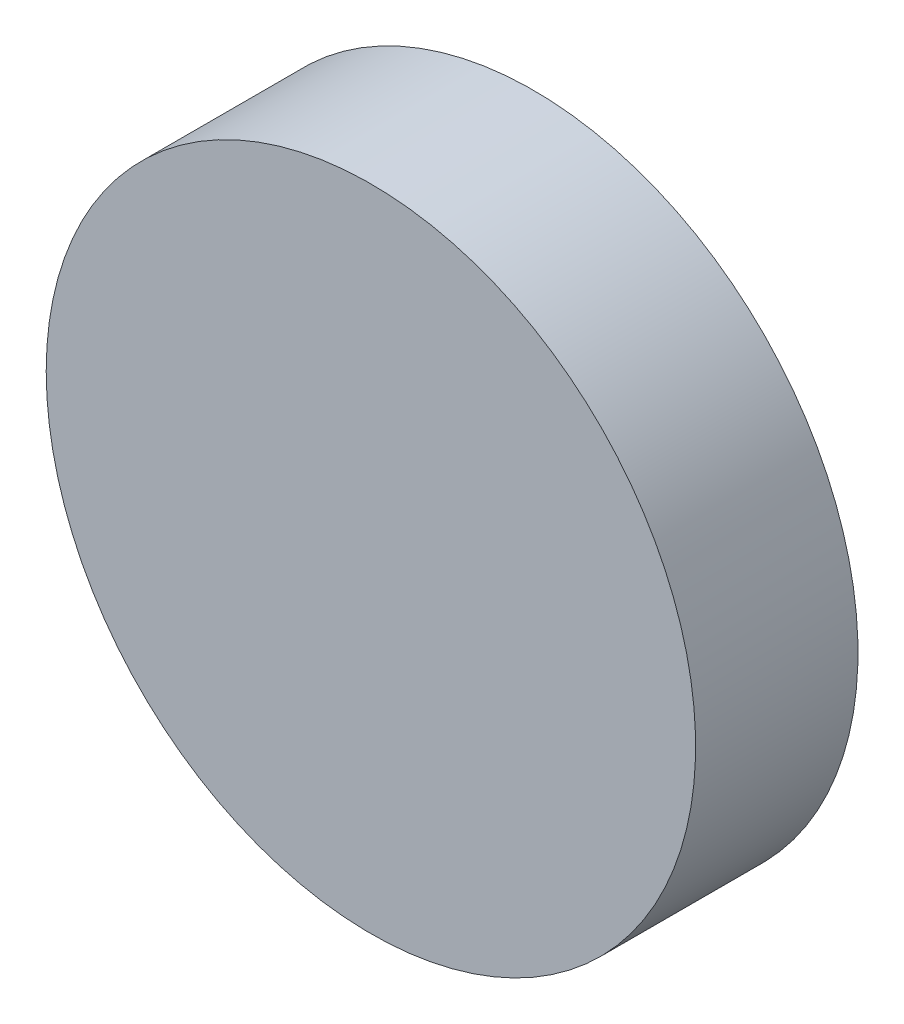
ISO-10303-21;
HEADER;
FILE_DESCRIPTION(('STEP AP214'),'2;1');
FILE_NAME('part.step','',(''),(''),'','','');
FILE_SCHEMA(('AUTOMOTIVE_DESIGN { 1 0 10303 214 1 1 1 1 }'));
ENDSEC;
DATA;
#1=APPLICATION_CONTEXT('core data for automotive mechanical design processes');
#2=APPLICATION_PROTOCOL_DEFINITION('international standard','automotive_design',2000,#1);
#3=PRODUCT_CONTEXT('',#1,'mechanical');
#4=PRODUCT('Part','Part','',(#3));
#5=PRODUCT_RELATED_PRODUCT_CATEGORY('part','',(#4));
#6=PRODUCT_DEFINITION_FORMATION('','',#4);
#7=PRODUCT_DEFINITION_CONTEXT('part definition',#1,'design');
#8=PRODUCT_DEFINITION('design','',#6,#7);
#9=PRODUCT_DEFINITION_SHAPE('','',#8);
#10=(LENGTH_UNIT() NAMED_UNIT(*) SI_UNIT(.MILLI.,.METRE.));
#11=(NAMED_UNIT(*) PLANE_ANGLE_UNIT() SI_UNIT($,.RADIAN.));
#12=(NAMED_UNIT(*) SI_UNIT($,.STERADIAN.) SOLID_ANGLE_UNIT());
#13=UNCERTAINTY_MEASURE_WITH_UNIT(LENGTH_MEASURE(1.E-05),#10,'distance_accuracy_value','');
#14=(GEOMETRIC_REPRESENTATION_CONTEXT(3) GLOBAL_UNCERTAINTY_ASSIGNED_CONTEXT((#13)) GLOBAL_UNIT_ASSIGNED_CONTEXT((#10,
#11,#12)) REPRESENTATION_CONTEXT('',''));
#15=CARTESIAN_POINT('',(0.,0.,0.));
#16=DIRECTION('',(0.,0.,1.));
#17=DIRECTION('',(1.,0.,0.));
#18=AXIS2_PLACEMENT_3D('',#15,#16,#17);
#19=CARTESIAN_POINT('',(-1.851,4.149,1.6));
#20=DIRECTION('',(0.,0.,1.));
#21=DIRECTION('',(1.,0.,0.));
#22=AXIS2_PLACEMENT_3D('',#19,#20,#21);
#23=PLANE('',#22);
#24=CARTESIAN_POINT('',(-1.65,4.35,1.6));
#25=DIRECTION('',(0.,0.,-1.));
#26=DIRECTION('',(-1.,0.,0.));
#27=AXIS2_PLACEMENT_3D('',#24,#25,#26);
#28=CIRCLE('',#27,0.2);
#29=CARTESIAN_POINT('',(-1.85,4.35,1.6));
#30=VERTEX_POINT('',#29);
#31=EDGE_CURVE('E18',#30,#30,#28,.T.);
#32=ORIENTED_EDGE('',*,*,#31,.F.);
#33=EDGE_LOOP('',(#32));
#34=FACE_BOUND('',#33,.T.);
#35=ADVANCED_FACE('F14',(#34),#23,.T.);
#36=CARTESIAN_POINT('',(-1.449,4.149,1.5));
#37=DIRECTION('',(0.,0.,-1.));
#38=DIRECTION('',(-1.,0.,0.));
#39=AXIS2_PLACEMENT_3D('',#36,#37,#38);
#40=PLANE('',#39);
#41=CARTESIAN_POINT('',(-1.65,4.35,1.5));
#42=DIRECTION('',(0.,0.,-1.));
#43=DIRECTION('',(-1.,0.,0.));
#44=AXIS2_PLACEMENT_3D('',#41,#42,#43);
#45=CIRCLE('',#44,0.2);
#46=CARTESIAN_POINT('',(-1.85,4.35,1.5));
#47=VERTEX_POINT('',#46);
#48=EDGE_CURVE('E10',#47,#47,#45,.F.);
#49=ORIENTED_EDGE('',*,*,#48,.F.);
#50=EDGE_LOOP('',(#49));
#51=FACE_BOUND('',#50,.T.);
#52=ADVANCED_FACE('F29',(#51),#40,.T.);
#53=CARTESIAN_POINT('',(-1.65,4.35,1.6));
#54=DIRECTION('',(0.,0.,-1.));
#55=DIRECTION('',(-1.,0.,0.));
#56=AXIS2_PLACEMENT_3D('',#53,#54,#55);
#57=CYLINDRICAL_SURFACE('',#56,0.2);
#58=ORIENTED_EDGE('',*,*,#48,.T.);
#59=EDGE_LOOP('',(#58));
#60=FACE_BOUND('',#59,.T.);
#61=ORIENTED_EDGE('',*,*,#31,.T.);
#62=EDGE_LOOP('',(#61));
#63=FACE_BOUND('',#62,.T.);
#64=ADVANCED_FACE('F16',(#60,#63),#57,.T.);
#65=CLOSED_SHELL('',(#35,#52,#64));
#66=MANIFOLD_SOLID_BREP('B1',#65);
#67=ADVANCED_BREP_SHAPE_REPRESENTATION('',(#18,#66),#14);
#68=SHAPE_DEFINITION_REPRESENTATION(#9,#67);
ENDSEC;
END-ISO-10303-21;
